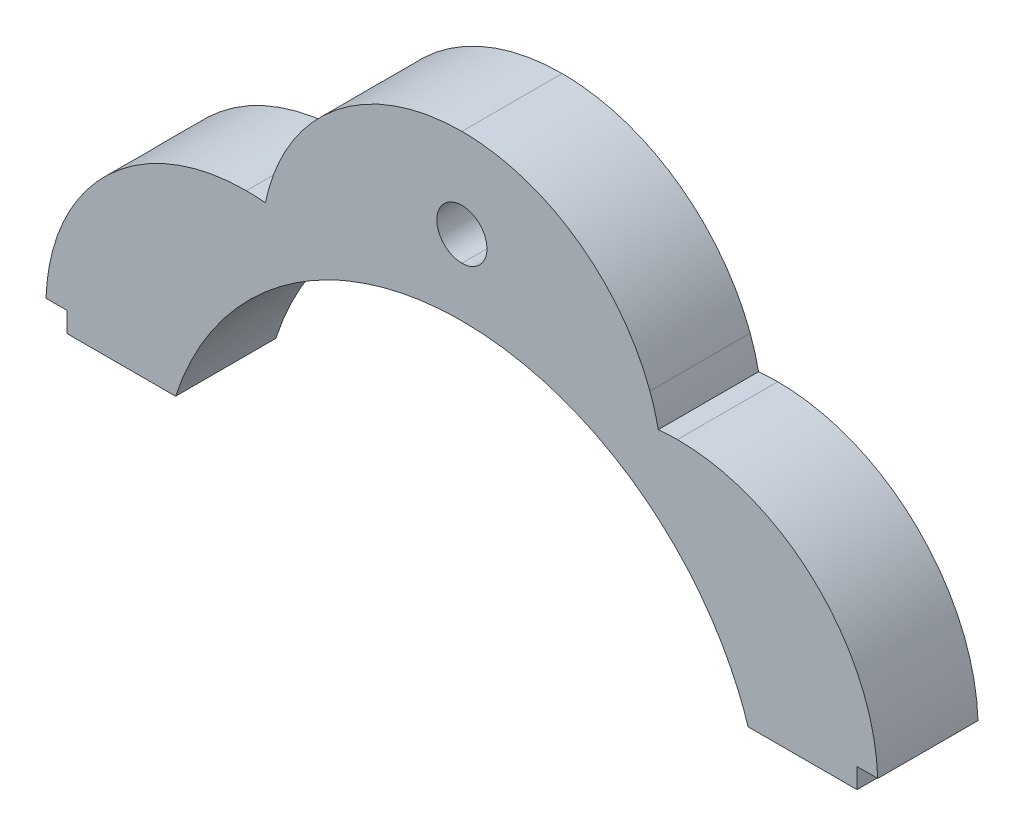
ISO-10303-21;
HEADER;
FILE_DESCRIPTION(('STEP AP214'),'2;1');
FILE_NAME('part.step','',(''),(''),'','','');
FILE_SCHEMA(('AUTOMOTIVE_DESIGN { 1 0 10303 214 1 1 1 1 }'));
ENDSEC;
DATA;
#1=APPLICATION_CONTEXT('core data for automotive mechanical design processes');
#2=APPLICATION_PROTOCOL_DEFINITION('international standard','automotive_design',2000,#1);
#3=PRODUCT_CONTEXT('',#1,'mechanical');
#4=PRODUCT('Part','Part','',(#3));
#5=PRODUCT_RELATED_PRODUCT_CATEGORY('part','',(#4));
#6=PRODUCT_DEFINITION_FORMATION('','',#4);
#7=PRODUCT_DEFINITION_CONTEXT('part definition',#1,'design');
#8=PRODUCT_DEFINITION('design','',#6,#7);
#9=PRODUCT_DEFINITION_SHAPE('','',#8);
#10=(LENGTH_UNIT() NAMED_UNIT(*) SI_UNIT(.MILLI.,.METRE.));
#11=(NAMED_UNIT(*) PLANE_ANGLE_UNIT() SI_UNIT($,.RADIAN.));
#12=(NAMED_UNIT(*) SI_UNIT($,.STERADIAN.) SOLID_ANGLE_UNIT());
#13=UNCERTAINTY_MEASURE_WITH_UNIT(LENGTH_MEASURE(1.E-05),#10,'distance_accuracy_value','');
#14=(GEOMETRIC_REPRESENTATION_CONTEXT(3) GLOBAL_UNCERTAINTY_ASSIGNED_CONTEXT((#13)) GLOBAL_UNIT_ASSIGNED_CONTEXT((#10,
#11,#12)) REPRESENTATION_CONTEXT('',''));
#15=CARTESIAN_POINT('',(0.,0.,0.));
#16=DIRECTION('',(0.,0.,1.));
#17=DIRECTION('',(1.,0.,0.));
#18=AXIS2_PLACEMENT_3D('',#15,#16,#17);
#19=CARTESIAN_POINT('',(-16.7632277139403,-1.22893531632878,10.));
#20=DIRECTION('',(0.,0.,-1.));
#21=DIRECTION('',(-1.,0.,0.));
#22=AXIS2_PLACEMENT_3D('',#19,#20,#21);
#23=PLANE('',#22);
#24=CARTESIAN_POINT('',(-10.6826691717253,-14.891134333299,10.));
#25=CARTESIAN_POINT('',(-11.0566127548024,-4.17374372454169,10.));
#26=CARTESIAN_POINT('',(-19.8619323055525,4.39522074407345,10.));
#27=CARTESIAN_POINT('',(-30.6675173587321,4.39522074407345,10.));
#28=B_SPLINE_CURVE_WITH_KNOTS('',3,(#24,#25,#26,#27),.UNSPECIFIED.,.F.,.F.,(4,4),(19.,20.),.UNSPECIFIED.);
#29=CARTESIAN_POINT('',(-10.6826691717253,-14.891134333299,10.));
#30=VERTEX_POINT('',#29);
#31=CARTESIAN_POINT('',(-30.6675173587321,4.39522074407345,10.));
#32=VERTEX_POINT('',#31);
#33=EDGE_CURVE('E373',#30,#32,#28,.T.);
#34=ORIENTED_EDGE('',*,*,#33,.T.);
#35=CARTESIAN_POINT('',(-30.6675173587321,4.39522074407345,10.));
#36=CARTESIAN_POINT('',(-31.3095754979488,4.39522074407345,10.));
#37=CARTESIAN_POINT('',(-31.9481024142931,4.36348280191558,10.));
#38=CARTESIAN_POINT('',(-32.576057193867,4.30349507677866,10.));
#39=B_SPLINE_CURVE_WITH_KNOTS('',3,(#35,#36,#37,#38),.UNSPECIFIED.,.F.,.F.,(4,4),(0.,1.),.UNSPECIFIED.);
#40=CARTESIAN_POINT('',(-32.576057193867,4.30349507677866,10.));
#41=VERTEX_POINT('',#40);
#42=EDGE_CURVE('E484',#32,#41,#39,.T.);
#43=ORIENTED_EDGE('',*,*,#42,.T.);
#44=CARTESIAN_POINT('',(-32.576057193867,4.30349507677866,10.));
#45=CARTESIAN_POINT('',(-32.7806528019973,5.30186221655729,10.));
#46=CARTESIAN_POINT('',(-33.0628922496264,6.27553232807602,10.));
#47=CARTESIAN_POINT('',(-33.4086075815712,7.21744296559011,10.));
#48=B_SPLINE_CURVE_WITH_KNOTS('',3,(#44,#45,#46,#47),.UNSPECIFIED.,.F.,.F.,(4,4),(1.,2.),.UNSPECIFIED.);
#49=CARTESIAN_POINT('',(-33.4086075815712,7.21744296559011,10.));
#50=VERTEX_POINT('',#49);
#51=EDGE_CURVE('E433',#41,#50,#48,.T.);
#52=ORIENTED_EDGE('',*,*,#51,.T.);
#53=CARTESIAN_POINT('',(-33.4086075815712,7.21744296559011,10.));
#54=CARTESIAN_POINT('',(-36.2308298030879,14.8374558827932,10.));
#55=CARTESIAN_POINT('',(-43.5650720497894,20.2702207401047,10.));
#56=CARTESIAN_POINT('',(-52.1693272152816,20.2702207401047,10.));
#57=B_SPLINE_CURVE_WITH_KNOTS('',3,(#53,#54,#55,#56),.UNSPECIFIED.,.F.,.F.,(4,4),(2.,3.),.UNSPECIFIED.);
#58=CARTESIAN_POINT('',(-52.1693272152816,20.2702207401047,10.));
#59=VERTEX_POINT('',#58);
#60=EDGE_CURVE('E451',#50,#59,#57,.T.);
#61=ORIENTED_EDGE('',*,*,#60,.T.);
#62=CARTESIAN_POINT('',(-52.1693272152816,20.2702207401047,10.));
#63=CARTESIAN_POINT('',(-60.7735823807738,20.2702207401047,10.));
#64=CARTESIAN_POINT('',(-68.1078246274754,14.8374558827932,10.));
#65=CARTESIAN_POINT('',(-70.930046848992,7.21744296559011,10.));
#66=B_SPLINE_CURVE_WITH_KNOTS('',3,(#62,#63,#64,#65),.UNSPECIFIED.,.F.,.F.,(4,4),(3.,4.),.UNSPECIFIED.);
#67=CARTESIAN_POINT('',(-70.930046848992,7.21744296559011,10.));
#68=VERTEX_POINT('',#67);
#69=EDGE_CURVE('E448',#59,#68,#66,.T.);
#70=ORIENTED_EDGE('',*,*,#69,.T.);
#71=CARTESIAN_POINT('',(-70.930046848992,7.21744296559011,10.));
#72=CARTESIAN_POINT('',(-71.2757837127836,6.27553232807602,10.));
#73=CARTESIAN_POINT('',(-71.558001628566,5.30186221655729,10.));
#74=CARTESIAN_POINT('',(-71.7625972366962,4.30349507677866,10.));
#75=B_SPLINE_CURVE_WITH_KNOTS('',3,(#71,#72,#73,#74),.UNSPECIFIED.,.F.,.F.,(4,4),(4.,5.),.UNSPECIFIED.);
#76=CARTESIAN_POINT('',(-71.7625972366962,4.30349507677866,10.));
#77=VERTEX_POINT('',#76);
#78=EDGE_CURVE('E450',#68,#77,#75,.T.);
#79=ORIENTED_EDGE('',*,*,#78,.T.);
#80=CARTESIAN_POINT('',(-71.7625972366962,4.30349507677866,10.));
#81=CARTESIAN_POINT('',(-72.3905520162701,4.36348280191558,10.));
#82=CARTESIAN_POINT('',(-73.025547709742,4.39522074407345,10.));
#83=CARTESIAN_POINT('',(-73.6676058489587,4.39522074407345,10.));
#84=B_SPLINE_CURVE_WITH_KNOTS('',3,(#80,#81,#82,#83),.UNSPECIFIED.,.F.,.F.,(4,4),(5.,6.),.UNSPECIFIED.);
#85=CARTESIAN_POINT('',(-73.6676058489587,4.39522074407345,10.));
#86=VERTEX_POINT('',#85);
#87=EDGE_CURVE('E453',#77,#86,#84,.T.);
#88=ORIENTED_EDGE('',*,*,#87,.T.);
#89=CARTESIAN_POINT('',(-73.6676058489587,4.39522074407345,10.));
#90=CARTESIAN_POINT('',(-84.4767221250108,4.39522074407345,10.));
#91=CARTESIAN_POINT('',(-93.2820416757608,-4.17374372454169,10.));
#92=CARTESIAN_POINT('',(-93.6559852588379,-14.891134333299,10.));
#93=B_SPLINE_CURVE_WITH_KNOTS('',3,(#89,#90,#91,#92),.UNSPECIFIED.,.F.,.F.,(4,4),(6.,7.),.UNSPECIFIED.);
#94=CARTESIAN_POINT('',(-93.6559852588379,-14.891134333299,10.));
#95=VERTEX_POINT('',#94);
#96=EDGE_CURVE('E801',#86,#95,#93,.T.);
#97=ORIENTED_EDGE('',*,*,#96,.T.);
#98=DIRECTION('',(1.,0.,0.));
#99=VECTOR('',#98,1.);
#100=CARTESIAN_POINT('',(-93.6559852588379,-14.891134333299,10.));
#101=LINE('',#100,#99);
#102=CARTESIAN_POINT('',(-91.5851814263478,-14.891134333299,10.));
#103=VERTEX_POINT('',#102);
#104=EDGE_CURVE('E799',#95,#103,#101,.T.);
#105=ORIENTED_EDGE('',*,*,#104,.T.);
#106=DIRECTION('',(0.,-1.,0.));
#107=VECTOR('',#106,1.);
#108=CARTESIAN_POINT('',(-91.5851814263478,-14.891134333299,10.));
#109=LINE('',#108,#107);
#110=CARTESIAN_POINT('',(-91.5851814263478,-16.8913783038818,10.));
#111=VERTEX_POINT('',#110);
#112=EDGE_CURVE('E797',#103,#111,#109,.T.);
#113=ORIENTED_EDGE('',*,*,#112,.T.);
#114=DIRECTION('',(1.,0.,0.));
#115=VECTOR('',#114,1.);
#116=CARTESIAN_POINT('',(-91.5851814263478,-16.8913783038818,10.));
#117=LINE('',#116,#115);
#118=CARTESIAN_POINT('',(-80.7266926256227,-16.8913783038818,10.));
#119=VERTEX_POINT('',#118);
#120=EDGE_CURVE('E792',#111,#119,#117,.T.);
#121=ORIENTED_EDGE('',*,*,#120,.T.);
#122=CARTESIAN_POINT('',(-80.7266926256227,-16.8913783038818,10.));
#123=CARTESIAN_POINT('',(-79.0298323762097,-11.6208774439256,10.));
#124=CARTESIAN_POINT('',(-75.9112673474212,-6.985393809288,10.));
#125=CARTESIAN_POINT('',(-71.8225849618331,-3.43645022700467,10.));
#126=B_SPLINE_CURVE_WITH_KNOTS('',3,(#122,#123,#124,#125),.UNSPECIFIED.,.F.,.F.,(4,4),(10.,11.),.UNSPECIFIED.);
#127=CARTESIAN_POINT('',(-71.8225849618331,-3.43645022700467,10.));
#128=VERTEX_POINT('',#127);
#129=EDGE_CURVE('E784',#119,#128,#126,.T.);
#130=ORIENTED_EDGE('',*,*,#129,.T.);
#131=CARTESIAN_POINT('',(-71.8225849618331,-3.43645022700467,10.));
#132=CARTESIAN_POINT('',(-69.3813472372915,-1.31978356086716,10.));
#133=CARTESIAN_POINT('',(-66.5979469355243,0.412367385422892,10.));
#134=CARTESIAN_POINT('',(-63.5605139054134,1.65766174410679,10.));
#135=B_SPLINE_CURVE_WITH_KNOTS('',3,(#131,#132,#133,#134),.UNSPECIFIED.,.F.,.F.,(4,4),(11.,12.),.UNSPECIFIED.);
#136=CARTESIAN_POINT('',(-63.5605139054134,1.65766174410679,10.));
#137=VERTEX_POINT('',#136);
#138=EDGE_CURVE('E768',#128,#137,#135,.T.);
#139=ORIENTED_EDGE('',*,*,#138,.T.);
#140=CARTESIAN_POINT('',(-63.5605139054134,1.65766174410679,10.));
#141=CARTESIAN_POINT('',(-60.0468610200071,3.10053232886977,10.));
#142=CARTESIAN_POINT('',(-56.2015746304519,3.89781355154371,10.));
#143=CARTESIAN_POINT('',(-52.1693272152816,3.89781355154371,10.));
#144=B_SPLINE_CURVE_WITH_KNOTS('',3,(#140,#141,#142,#143),.UNSPECIFIED.,.F.,.F.,(4,4),(12.,13.),.UNSPECIFIED.);
#145=CARTESIAN_POINT('',(-52.1693272152816,3.89781355154371,10.));
#146=VERTEX_POINT('',#145);
#147=EDGE_CURVE('E767',#137,#146,#144,.T.);
#148=ORIENTED_EDGE('',*,*,#147,.T.);
#149=CARTESIAN_POINT('',(-52.1693272152816,3.89781355154371,10.));
#150=CARTESIAN_POINT('',(-48.1370798001113,3.89781355154371,10.));
#151=CARTESIAN_POINT('',(-44.2882837195305,3.10053232886977,10.));
#152=CARTESIAN_POINT('',(-40.7746093022774,1.65415205308119,10.));
#153=B_SPLINE_CURVE_WITH_KNOTS('',3,(#149,#150,#151,#152),.UNSPECIFIED.,.F.,.F.,(4,4),(13.,14.),.UNSPECIFIED.);
#154=CARTESIAN_POINT('',(-40.7746093022774,1.65415205308119,10.));
#155=VERTEX_POINT('',#154);
#156=EDGE_CURVE('E766',#146,#155,#153,.T.);
#157=ORIENTED_EDGE('',*,*,#156,.T.);
#158=CARTESIAN_POINT('',(-40.7746093022774,1.65415205308119,10.));
#159=CARTESIAN_POINT('',(-37.7407074950389,0.40883616255051,10.));
#160=CARTESIAN_POINT('',(-34.9537759703993,-1.31978356086716,10.));
#161=CARTESIAN_POINT('',(-32.5160694687301,-3.43645022700467,10.));
#162=B_SPLINE_CURVE_WITH_KNOTS('',3,(#158,#159,#160,#161),.UNSPECIFIED.,.F.,.F.,(4,4),(14.,15.),.UNSPECIFIED.);
#163=CARTESIAN_POINT('',(-32.5160694687301,-3.43645022700467,10.));
#164=VERTEX_POINT('',#163);
#165=EDGE_CURVE('E248',#155,#164,#162,.T.);
#166=ORIENTED_EDGE('',*,*,#165,.T.);
#167=CARTESIAN_POINT('',(-32.5160694687301,-3.43645022700467,10.));
#168=CARTESIAN_POINT('',(-28.427387083142,-6.985393809288,10.));
#169=CARTESIAN_POINT('',(-25.3088220543535,-11.6208774439256,10.));
#170=CARTESIAN_POINT('',(-23.6119618049405,-16.8913783038818,10.));
#171=B_SPLINE_CURVE_WITH_KNOTS('',3,(#167,#168,#169,#170),.UNSPECIFIED.,.F.,.F.,(4,4),(15.,16.),.UNSPECIFIED.);
#172=CARTESIAN_POINT('',(-23.6119618049405,-16.8913783038818,10.));
#173=VERTEX_POINT('',#172);
#174=EDGE_CURVE('E242',#164,#173,#171,.T.);
#175=ORIENTED_EDGE('',*,*,#174,.T.);
#176=DIRECTION('',(1.,0.,0.));
#177=VECTOR('',#176,1.);
#178=CARTESIAN_POINT('',(-23.6119618049405,-16.8913783038818,10.));
#179=LINE('',#178,#177);
#180=CARTESIAN_POINT('',(-12.7534730042154,-16.8913783038818,10.));
#181=VERTEX_POINT('',#180);
#182=EDGE_CURVE('E247',#173,#181,#179,.T.);
#183=ORIENTED_EDGE('',*,*,#182,.T.);
#184=DIRECTION('',(0.,1.,0.));
#185=VECTOR('',#184,1.);
#186=CARTESIAN_POINT('',(-12.7534730042154,-16.8913783038818,10.));
#187=LINE('',#186,#185);
#188=CARTESIAN_POINT('',(-12.7534730042154,-14.891134333299,10.));
#189=VERTEX_POINT('',#188);
#190=EDGE_CURVE('E257',#181,#189,#187,.T.);
#191=ORIENTED_EDGE('',*,*,#190,.T.);
#192=DIRECTION('',(1.,0.,0.));
#193=VECTOR('',#192,1.);
#194=CARTESIAN_POINT('',(-12.7534730042154,-14.891134333299,10.));
#195=LINE('',#194,#193);
#196=EDGE_CURVE('E259',#189,#30,#195,.T.);
#197=ORIENTED_EDGE('',*,*,#196,.T.);
#198=EDGE_LOOP('',(#34,#43,#52,#61,#70,#79,#88,#97,#105,#113,#121,#130,#139,#148,#157,#166,#175,
#183,#191,#197));
#199=FACE_BOUND('',#198,.T.);
#200=CARTESIAN_POINT('',(-52.1693272152816,8.88256527284527,10.));
#201=CARTESIAN_POINT('',(-50.7899755785279,8.88256527284527,10.));
#202=CARTESIAN_POINT('',(-49.6681448292967,10.0043960220765,10.));
#203=CARTESIAN_POINT('',(-49.6681448292967,11.3837476588302,10.));
#204=CARTESIAN_POINT('',(-49.6681448292967,12.7631208274307,10.));
#205=CARTESIAN_POINT('',(-50.7899755785279,13.8849515766619,10.));
#206=CARTESIAN_POINT('',(-52.1693272152816,13.8849515766619,10.));
#207=B_SPLINE_CURVE_WITH_KNOTS('',3,(#200,#201,#202,#203,#204,#205,#206),.UNSPECIFIED.,.F.,.F.,
(4,3,4),(0.,1.,2.),.UNSPECIFIED.);
#208=CARTESIAN_POINT('',(-52.1693272152816,8.88256527284527,10.));
#209=VERTEX_POINT('',#208);
#210=CARTESIAN_POINT('',(-52.1693272152816,13.8849515766619,10.));
#211=VERTEX_POINT('',#210);
#212=EDGE_CURVE('E194',#209,#211,#207,.T.);
#213=ORIENTED_EDGE('',*,*,#212,.F.);
#214=CARTESIAN_POINT('',(-52.1693272152816,13.8849515766619,10.));
#215=CARTESIAN_POINT('',(-53.5487003838821,13.8849515766619,10.));
#216=CARTESIAN_POINT('',(-54.6705311331133,12.7631208274307,10.));
#217=CARTESIAN_POINT('',(-54.6705311331133,11.3837476588302,10.));
#218=CARTESIAN_POINT('',(-54.6705311331133,10.0043960220765,10.));
#219=CARTESIAN_POINT('',(-53.5487003838821,8.88256527284527,10.));
#220=CARTESIAN_POINT('',(-52.1693272152816,8.88256527284527,10.));
#221=B_SPLINE_CURVE_WITH_KNOTS('',3,(#214,#215,#216,#217,#218,#219,#220),.UNSPECIFIED.,.F.,.F.,
(4,3,4),(2.,3.,4.),.UNSPECIFIED.);
#222=EDGE_CURVE('E188',#211,#209,#221,.T.);
#223=ORIENTED_EDGE('',*,*,#222,.F.);
#224=EDGE_LOOP('',(#213,#223));
#225=FACE_BOUND('',#224,.T.);
#226=ADVANCED_FACE('F39',(#199,#225),#23,.F.);
#227=CARTESIAN_POINT('',(-16.7632277139403,-1.22893531632878,0.));
#228=DIRECTION('',(0.,0.,-1.));
#229=DIRECTION('',(-1.,0.,0.));
#230=AXIS2_PLACEMENT_3D('',#227,#228,#229);
#231=PLANE('',#230);
#232=CARTESIAN_POINT('',(-10.6826691717253,-14.891134333299,0.));
#233=CARTESIAN_POINT('',(-11.0566127548024,-4.17374372454169,0.));
#234=CARTESIAN_POINT('',(-19.8619323055525,4.39522074407345,0.));
#235=CARTESIAN_POINT('',(-30.6675173587321,4.39522074407345,0.));
#236=B_SPLINE_CURVE_WITH_KNOTS('',3,(#232,#233,#234,#235),.UNSPECIFIED.,.F.,.F.,(4,4),(19.,20.),.UNSPECIFIED.);
#237=CARTESIAN_POINT('',(-10.6826691717253,-14.891134333299,0.));
#238=VERTEX_POINT('',#237);
#239=CARTESIAN_POINT('',(-30.6675173587321,4.39522074407345,0.));
#240=VERTEX_POINT('',#239);
#241=EDGE_CURVE('E262',#238,#240,#236,.T.);
#242=ORIENTED_EDGE('',*,*,#241,.F.);
#243=DIRECTION('',(1.,0.,0.));
#244=VECTOR('',#243,1.);
#245=CARTESIAN_POINT('',(-12.7534730042154,-14.891134333299,0.));
#246=LINE('',#245,#244);
#247=CARTESIAN_POINT('',(-12.7534730042154,-14.891134333299,0.));
#248=VERTEX_POINT('',#247);
#249=EDGE_CURVE('E371',#248,#238,#246,.T.);
#250=ORIENTED_EDGE('',*,*,#249,.F.);
#251=DIRECTION('',(0.,1.,0.));
#252=VECTOR('',#251,1.);
#253=CARTESIAN_POINT('',(-12.7534730042154,-16.8913783038818,0.));
#254=LINE('',#253,#252);
#255=CARTESIAN_POINT('',(-12.7534730042154,-16.8913783038818,0.));
#256=VERTEX_POINT('',#255);
#257=EDGE_CURVE('E369',#256,#248,#254,.T.);
#258=ORIENTED_EDGE('',*,*,#257,.F.);
#259=DIRECTION('',(1.,0.,0.));
#260=VECTOR('',#259,1.);
#261=CARTESIAN_POINT('',(-23.6119618049405,-16.8913783038818,0.));
#262=LINE('',#261,#260);
#263=CARTESIAN_POINT('',(-23.6119618049405,-16.8913783038818,0.));
#264=VERTEX_POINT('',#263);
#265=EDGE_CURVE('E364',#264,#256,#262,.T.);
#266=ORIENTED_EDGE('',*,*,#265,.F.);
#267=CARTESIAN_POINT('',(-32.5160694687301,-3.43645022700467,0.));
#268=CARTESIAN_POINT('',(-28.427387083142,-6.985393809288,0.));
#269=CARTESIAN_POINT('',(-25.3088220543535,-11.6208774439256,0.));
#270=CARTESIAN_POINT('',(-23.6119618049405,-16.8913783038818,0.));
#271=B_SPLINE_CURVE_WITH_KNOTS('',3,(#267,#268,#269,#270),.UNSPECIFIED.,.F.,.F.,(4,4),(15.,16.),.UNSPECIFIED.);
#272=CARTESIAN_POINT('',(-32.5160694687301,-3.43645022700467,0.));
#273=VERTEX_POINT('',#272);
#274=EDGE_CURVE('E357',#273,#264,#271,.T.);
#275=ORIENTED_EDGE('',*,*,#274,.F.);
#276=CARTESIAN_POINT('',(-40.7746093022774,1.65415205308119,0.));
#277=CARTESIAN_POINT('',(-37.7407074950389,0.40883616255051,0.));
#278=CARTESIAN_POINT('',(-34.9537759703993,-1.31978356086716,0.));
#279=CARTESIAN_POINT('',(-32.5160694687301,-3.43645022700467,0.));
#280=B_SPLINE_CURVE_WITH_KNOTS('',3,(#276,#277,#278,#279),.UNSPECIFIED.,.F.,.F.,(4,4),(14.,15.),.UNSPECIFIED.);
#281=CARTESIAN_POINT('',(-40.7746093022774,1.65415205308119,0.));
#282=VERTEX_POINT('',#281);
#283=EDGE_CURVE('E350',#282,#273,#280,.T.);
#284=ORIENTED_EDGE('',*,*,#283,.F.);
#285=CARTESIAN_POINT('',(-52.1693272152816,3.89781355154371,0.));
#286=CARTESIAN_POINT('',(-48.1370798001113,3.89781355154371,0.));
#287=CARTESIAN_POINT('',(-44.2882837195305,3.10053232886977,0.));
#288=CARTESIAN_POINT('',(-40.7746093022774,1.65415205308119,0.));
#289=B_SPLINE_CURVE_WITH_KNOTS('',3,(#285,#286,#287,#288),.UNSPECIFIED.,.F.,.F.,(4,4),(13.,14.),.UNSPECIFIED.);
#290=CARTESIAN_POINT('',(-52.1693272152816,3.89781355154371,0.));
#291=VERTEX_POINT('',#290);
#292=EDGE_CURVE('E343',#291,#282,#289,.T.);
#293=ORIENTED_EDGE('',*,*,#292,.F.);
#294=CARTESIAN_POINT('',(-63.5605139054134,1.65766174410679,0.));
#295=CARTESIAN_POINT('',(-60.0468610200071,3.10053232886977,0.));
#296=CARTESIAN_POINT('',(-56.2015746304519,3.89781355154371,0.));
#297=CARTESIAN_POINT('',(-52.1693272152816,3.89781355154371,0.));
#298=B_SPLINE_CURVE_WITH_KNOTS('',3,(#294,#295,#296,#297),.UNSPECIFIED.,.F.,.F.,(4,4),(12.,13.),.UNSPECIFIED.);
#299=CARTESIAN_POINT('',(-63.5605139054134,1.65766174410679,0.));
#300=VERTEX_POINT('',#299);
#301=EDGE_CURVE('E336',#300,#291,#298,.T.);
#302=ORIENTED_EDGE('',*,*,#301,.F.);
#303=CARTESIAN_POINT('',(-71.8225849618331,-3.43645022700467,0.));
#304=CARTESIAN_POINT('',(-69.3813472372915,-1.31978356086716,0.));
#305=CARTESIAN_POINT('',(-66.5979469355243,0.412367385422892,0.));
#306=CARTESIAN_POINT('',(-63.5605139054134,1.65766174410679,0.));
#307=B_SPLINE_CURVE_WITH_KNOTS('',3,(#303,#304,#305,#306),.UNSPECIFIED.,.F.,.F.,(4,4),(11.,12.),.UNSPECIFIED.);
#308=CARTESIAN_POINT('',(-71.8225849618331,-3.43645022700467,0.));
#309=VERTEX_POINT('',#308);
#310=EDGE_CURVE('E329',#309,#300,#307,.T.);
#311=ORIENTED_EDGE('',*,*,#310,.F.);
#312=CARTESIAN_POINT('',(-80.7266926256227,-16.8913783038818,0.));
#313=CARTESIAN_POINT('',(-79.0298323762097,-11.6208774439256,0.));
#314=CARTESIAN_POINT('',(-75.9112673474212,-6.985393809288,0.));
#315=CARTESIAN_POINT('',(-71.8225849618331,-3.43645022700467,0.));
#316=B_SPLINE_CURVE_WITH_KNOTS('',3,(#312,#313,#314,#315),.UNSPECIFIED.,.F.,.F.,(4,4),(10.,11.),.UNSPECIFIED.);
#317=CARTESIAN_POINT('',(-80.7266926256227,-16.8913783038818,0.));
#318=VERTEX_POINT('',#317);
#319=EDGE_CURVE('E325',#318,#309,#316,.T.);
#320=ORIENTED_EDGE('',*,*,#319,.F.);
#321=DIRECTION('',(1.,0.,0.));
#322=VECTOR('',#321,1.);
#323=CARTESIAN_POINT('',(-91.5851814263478,-16.8913783038818,0.));
#324=LINE('',#323,#322);
#325=CARTESIAN_POINT('',(-91.5851814263478,-16.8913783038818,0.));
#326=VERTEX_POINT('',#325);
#327=EDGE_CURVE('E323',#326,#318,#324,.T.);
#328=ORIENTED_EDGE('',*,*,#327,.F.);
#329=DIRECTION('',(0.,-1.,0.));
#330=VECTOR('',#329,1.);
#331=CARTESIAN_POINT('',(-91.5851814263478,-14.891134333299,0.));
#332=LINE('',#331,#330);
#333=CARTESIAN_POINT('',(-91.5851814263478,-14.891134333299,0.));
#334=VERTEX_POINT('',#333);
#335=EDGE_CURVE('E321',#334,#326,#332,.T.);
#336=ORIENTED_EDGE('',*,*,#335,.F.);
#337=DIRECTION('',(1.,0.,0.));
#338=VECTOR('',#337,1.);
#339=CARTESIAN_POINT('',(-93.6559852588379,-14.891134333299,0.));
#340=LINE('',#339,#338);
#341=CARTESIAN_POINT('',(-93.6559852588379,-14.891134333299,0.));
#342=VERTEX_POINT('',#341);
#343=EDGE_CURVE('E316',#342,#334,#340,.T.);
#344=ORIENTED_EDGE('',*,*,#343,.F.);
#345=CARTESIAN_POINT('',(-73.6676058489587,4.39522074407345,0.));
#346=CARTESIAN_POINT('',(-84.4767221250108,4.39522074407345,0.));
#347=CARTESIAN_POINT('',(-93.2820416757608,-4.17374372454169,0.));
#348=CARTESIAN_POINT('',(-93.6559852588379,-14.891134333299,0.));
#349=B_SPLINE_CURVE_WITH_KNOTS('',3,(#345,#346,#347,#348),.UNSPECIFIED.,.F.,.F.,(4,4),(6.,7.),.UNSPECIFIED.);
#350=CARTESIAN_POINT('',(-73.6676058489587,4.39522074407345,0.));
#351=VERTEX_POINT('',#350);
#352=EDGE_CURVE('E309',#351,#342,#349,.T.);
#353=ORIENTED_EDGE('',*,*,#352,.F.);
#354=CARTESIAN_POINT('',(-71.7625972366962,4.30349507677866,0.));
#355=CARTESIAN_POINT('',(-72.3905520162701,4.36348280191558,0.));
#356=CARTESIAN_POINT('',(-73.025547709742,4.39522074407345,0.));
#357=CARTESIAN_POINT('',(-73.6676058489587,4.39522074407345,0.));
#358=B_SPLINE_CURVE_WITH_KNOTS('',3,(#354,#355,#356,#357),.UNSPECIFIED.,.F.,.F.,(4,4),(5.,6.),.UNSPECIFIED.);
#359=CARTESIAN_POINT('',(-71.7625972366962,4.30349507677866,0.));
#360=VERTEX_POINT('',#359);
#361=EDGE_CURVE('E302',#360,#351,#358,.T.);
#362=ORIENTED_EDGE('',*,*,#361,.F.);
#363=CARTESIAN_POINT('',(-70.930046848992,7.21744296559011,0.));
#364=CARTESIAN_POINT('',(-71.2757837127836,6.27553232807602,0.));
#365=CARTESIAN_POINT('',(-71.558001628566,5.30186221655729,0.));
#366=CARTESIAN_POINT('',(-71.7625972366962,4.30349507677866,0.));
#367=B_SPLINE_CURVE_WITH_KNOTS('',3,(#363,#364,#365,#366),.UNSPECIFIED.,.F.,.F.,(4,4),(4.,5.),.UNSPECIFIED.);
#368=CARTESIAN_POINT('',(-70.930046848992,7.21744296559011,0.));
#369=VERTEX_POINT('',#368);
#370=EDGE_CURVE('E295',#369,#360,#367,.T.);
#371=ORIENTED_EDGE('',*,*,#370,.F.);
#372=CARTESIAN_POINT('',(-52.1693272152816,20.2702207401047,0.));
#373=CARTESIAN_POINT('',(-60.7735823807738,20.2702207401047,0.));
#374=CARTESIAN_POINT('',(-68.1078246274754,14.8374558827932,0.));
#375=CARTESIAN_POINT('',(-70.930046848992,7.21744296559011,0.));
#376=B_SPLINE_CURVE_WITH_KNOTS('',3,(#372,#373,#374,#375),.UNSPECIFIED.,.F.,.F.,(4,4),(3.,4.),.UNSPECIFIED.);
#377=CARTESIAN_POINT('',(-52.1693272152816,20.2702207401047,0.));
#378=VERTEX_POINT('',#377);
#379=EDGE_CURVE('E288',#378,#369,#376,.T.);
#380=ORIENTED_EDGE('',*,*,#379,.F.);
#381=CARTESIAN_POINT('',(-33.4086075815712,7.21744296559011,0.));
#382=CARTESIAN_POINT('',(-36.2308298030879,14.8374558827932,0.));
#383=CARTESIAN_POINT('',(-43.5650720497894,20.2702207401047,0.));
#384=CARTESIAN_POINT('',(-52.1693272152816,20.2702207401047,0.));
#385=B_SPLINE_CURVE_WITH_KNOTS('',3,(#381,#382,#383,#384),.UNSPECIFIED.,.F.,.F.,(4,4),(2.,3.),.UNSPECIFIED.);
#386=CARTESIAN_POINT('',(-33.4086075815712,7.21744296559011,0.));
#387=VERTEX_POINT('',#386);
#388=EDGE_CURVE('E281',#387,#378,#385,.T.);
#389=ORIENTED_EDGE('',*,*,#388,.F.);
#390=CARTESIAN_POINT('',(-32.576057193867,4.30349507677866,0.));
#391=CARTESIAN_POINT('',(-32.7806528019973,5.30186221655729,0.));
#392=CARTESIAN_POINT('',(-33.0628922496264,6.27553232807602,0.));
#393=CARTESIAN_POINT('',(-33.4086075815712,7.21744296559011,0.));
#394=B_SPLINE_CURVE_WITH_KNOTS('',3,(#390,#391,#392,#393),.UNSPECIFIED.,.F.,.F.,(4,4),(1.,2.),.UNSPECIFIED.);
#395=CARTESIAN_POINT('',(-32.576057193867,4.30349507677866,0.));
#396=VERTEX_POINT('',#395);
#397=EDGE_CURVE('E274',#396,#387,#394,.T.);
#398=ORIENTED_EDGE('',*,*,#397,.F.);
#399=CARTESIAN_POINT('',(-30.6675173587321,4.39522074407345,0.));
#400=CARTESIAN_POINT('',(-31.3095754979488,4.39522074407345,0.));
#401=CARTESIAN_POINT('',(-31.9481024142931,4.36348280191558,0.));
#402=CARTESIAN_POINT('',(-32.576057193867,4.30349507677866,0.));
#403=B_SPLINE_CURVE_WITH_KNOTS('',3,(#399,#400,#401,#402),.UNSPECIFIED.,.F.,.F.,(4,4),(0.,1.),.UNSPECIFIED.);
#404=EDGE_CURVE('E267',#240,#396,#403,.T.);
#405=ORIENTED_EDGE('',*,*,#404,.F.);
#406=EDGE_LOOP('',(#242,#250,#258,#266,#275,#284,#293,#302,#311,#320,#328,#336,#344,#353,#362,
#371,#380,#389,#398,#405));
#407=FACE_BOUND('',#406,.T.);
#408=CARTESIAN_POINT('',(-52.1693272152816,13.8849515766619,0.));
#409=CARTESIAN_POINT('',(-53.5487003838821,13.8849515766619,0.));
#410=CARTESIAN_POINT('',(-54.6705311331133,12.7631208274307,0.));
#411=CARTESIAN_POINT('',(-54.6705311331133,11.3837476588302,0.));
#412=CARTESIAN_POINT('',(-54.6705311331133,10.0043960220765,0.));
#413=CARTESIAN_POINT('',(-53.5487003838821,8.88256527284527,0.));
#414=CARTESIAN_POINT('',(-52.1693272152816,8.88256527284527,0.));
#415=B_SPLINE_CURVE_WITH_KNOTS('',3,(#408,#409,#410,#411,#412,#413,#414),.UNSPECIFIED.,.F.,.F.,
(4,3,4),(2.,3.,4.),.UNSPECIFIED.);
#416=CARTESIAN_POINT('',(-52.1693272152816,13.8849515766619,0.));
#417=VERTEX_POINT('',#416);
#418=CARTESIAN_POINT('',(-52.1693272152816,8.88256527284527,0.));
#419=VERTEX_POINT('',#418);
#420=EDGE_CURVE('E198',#417,#419,#415,.T.);
#421=ORIENTED_EDGE('',*,*,#420,.T.);
#422=CARTESIAN_POINT('',(-52.1693272152816,8.88256527284527,0.));
#423=CARTESIAN_POINT('',(-50.7899755785279,8.88256527284527,0.));
#424=CARTESIAN_POINT('',(-49.6681448292967,10.0043960220765,0.));
#425=CARTESIAN_POINT('',(-49.6681448292967,11.3837476588302,0.));
#426=CARTESIAN_POINT('',(-49.6681448292967,12.7631208274307,0.));
#427=CARTESIAN_POINT('',(-50.7899755785279,13.8849515766619,0.));
#428=CARTESIAN_POINT('',(-52.1693272152816,13.8849515766619,0.));
#429=B_SPLINE_CURVE_WITH_KNOTS('',3,(#422,#423,#424,#425,#426,#427,#428),.UNSPECIFIED.,.F.,.F.,
(4,3,4),(0.,1.,2.),.UNSPECIFIED.);
#430=EDGE_CURVE('E62',#419,#417,#429,.T.);
#431=ORIENTED_EDGE('',*,*,#430,.T.);
#432=EDGE_LOOP('',(#421,#431));
#433=FACE_BOUND('',#432,.T.);
#434=ADVANCED_FACE('F218',(#407,#433),#231,.T.);
#435=DIRECTION('',(0.,0.,-1.));
#436=VECTOR('',#435,1.);
#437=SURFACE_OF_LINEAR_EXTRUSION('',#28,#436);
#438=ORIENTED_EDGE('',*,*,#241,.T.);
#439=DIRECTION('',(0.,0.,-1.));
#440=VECTOR('',#439,1.);
#441=CARTESIAN_POINT('',(-30.6675173587321,4.39522074407345,10.));
#442=LINE('',#441,#440);
#443=EDGE_CURVE('E11',#32,#240,#442,.T.);
#444=ORIENTED_EDGE('',*,*,#443,.F.);
#445=ORIENTED_EDGE('',*,*,#33,.F.);
#446=DIRECTION('',(0.,0.,-1.));
#447=VECTOR('',#446,1.);
#448=CARTESIAN_POINT('',(-10.6826691717253,-14.891134333299,10.));
#449=LINE('',#448,#447);
#450=EDGE_CURVE('E261',#30,#238,#449,.T.);
#451=ORIENTED_EDGE('',*,*,#450,.T.);
#452=EDGE_LOOP('',(#438,#444,#445,#451));
#453=FACE_BOUND('',#452,.T.);
#454=ADVANCED_FACE('F41',(#453),#437,.F.);
#455=DIRECTION('',(0.,0.,-1.));
#456=VECTOR('',#455,1.);
#457=SURFACE_OF_LINEAR_EXTRUSION('',#39,#456);
#458=ORIENTED_EDGE('',*,*,#404,.T.);
#459=DIRECTION('',(0.,0.,-1.));
#460=VECTOR('',#459,1.);
#461=CARTESIAN_POINT('',(-32.576057193867,4.30349507677866,10.));
#462=LINE('',#461,#460);
#463=EDGE_CURVE('E48',#41,#396,#462,.T.);
#464=ORIENTED_EDGE('',*,*,#463,.F.);
#465=ORIENTED_EDGE('',*,*,#42,.F.);
#466=ORIENTED_EDGE('',*,*,#443,.T.);
#467=EDGE_LOOP('',(#458,#464,#465,#466));
#468=FACE_BOUND('',#467,.T.);
#469=ADVANCED_FACE('F479',(#468),#457,.F.);
#470=DIRECTION('',(0.,0.,-1.));
#471=VECTOR('',#470,1.);
#472=SURFACE_OF_LINEAR_EXTRUSION('',#48,#471);
#473=ORIENTED_EDGE('',*,*,#397,.T.);
#474=DIRECTION('',(0.,0.,-1.));
#475=VECTOR('',#474,1.);
#476=CARTESIAN_POINT('',(-33.4086075815712,7.21744296559011,10.));
#477=LINE('',#476,#475);
#478=EDGE_CURVE('E424',#50,#387,#477,.T.);
#479=ORIENTED_EDGE('',*,*,#478,.F.);
#480=ORIENTED_EDGE('',*,*,#51,.F.);
#481=ORIENTED_EDGE('',*,*,#463,.T.);
#482=EDGE_LOOP('',(#473,#479,#480,#481));
#483=FACE_BOUND('',#482,.T.);
#484=ADVANCED_FACE('F431',(#483),#472,.F.);
#485=DIRECTION('',(0.,0.,-1.));
#486=VECTOR('',#485,1.);
#487=SURFACE_OF_LINEAR_EXTRUSION('',#57,#486);
#488=ORIENTED_EDGE('',*,*,#388,.T.);
#489=DIRECTION('',(0.,0.,-1.));
#490=VECTOR('',#489,1.);
#491=CARTESIAN_POINT('',(-52.1693272152816,20.2702207401047,10.));
#492=LINE('',#491,#490);
#493=EDGE_CURVE('E421',#59,#378,#492,.T.);
#494=ORIENTED_EDGE('',*,*,#493,.F.);
#495=ORIENTED_EDGE('',*,*,#60,.F.);
#496=ORIENTED_EDGE('',*,*,#478,.T.);
#497=EDGE_LOOP('',(#488,#494,#495,#496));
#498=FACE_BOUND('',#497,.T.);
#499=ADVANCED_FACE('F442',(#498),#487,.F.);
#500=DIRECTION('',(0.,0.,-1.));
#501=VECTOR('',#500,1.);
#502=SURFACE_OF_LINEAR_EXTRUSION('',#66,#501);
#503=ORIENTED_EDGE('',*,*,#379,.T.);
#504=DIRECTION('',(0.,0.,-1.));
#505=VECTOR('',#504,1.);
#506=CARTESIAN_POINT('',(-70.930046848992,7.21744296559011,10.));
#507=LINE('',#506,#505);
#508=EDGE_CURVE('E418',#68,#369,#507,.T.);
#509=ORIENTED_EDGE('',*,*,#508,.F.);
#510=ORIENTED_EDGE('',*,*,#69,.F.);
#511=ORIENTED_EDGE('',*,*,#493,.T.);
#512=EDGE_LOOP('',(#503,#509,#510,#511));
#513=FACE_BOUND('',#512,.T.);
#514=ADVANCED_FACE('F446',(#513),#502,.F.);
#515=DIRECTION('',(0.,0.,-1.));
#516=VECTOR('',#515,1.);
#517=SURFACE_OF_LINEAR_EXTRUSION('',#75,#516);
#518=ORIENTED_EDGE('',*,*,#370,.T.);
#519=DIRECTION('',(0.,0.,-1.));
#520=VECTOR('',#519,1.);
#521=CARTESIAN_POINT('',(-71.7625972366962,4.30349507677866,10.));
#522=LINE('',#521,#520);
#523=EDGE_CURVE('E415',#77,#360,#522,.T.);
#524=ORIENTED_EDGE('',*,*,#523,.F.);
#525=ORIENTED_EDGE('',*,*,#78,.F.);
#526=ORIENTED_EDGE('',*,*,#508,.T.);
#527=EDGE_LOOP('',(#518,#524,#525,#526));
#528=FACE_BOUND('',#527,.T.);
#529=ADVANCED_FACE('F474',(#528),#517,.F.);
#530=DIRECTION('',(0.,0.,-1.));
#531=VECTOR('',#530,1.);
#532=SURFACE_OF_LINEAR_EXTRUSION('',#84,#531);
#533=ORIENTED_EDGE('',*,*,#361,.T.);
#534=DIRECTION('',(0.,0.,-1.));
#535=VECTOR('',#534,1.);
#536=CARTESIAN_POINT('',(-73.6676058489587,4.39522074407345,10.));
#537=LINE('',#536,#535);
#538=EDGE_CURVE('E412',#86,#351,#537,.T.);
#539=ORIENTED_EDGE('',*,*,#538,.F.);
#540=ORIENTED_EDGE('',*,*,#87,.F.);
#541=ORIENTED_EDGE('',*,*,#523,.T.);
#542=EDGE_LOOP('',(#533,#539,#540,#541));
#543=FACE_BOUND('',#542,.T.);
#544=ADVANCED_FACE('F579',(#543),#532,.F.);
#545=DIRECTION('',(0.,0.,-1.));
#546=VECTOR('',#545,1.);
#547=SURFACE_OF_LINEAR_EXTRUSION('',#93,#546);
#548=ORIENTED_EDGE('',*,*,#352,.T.);
#549=DIRECTION('',(0.,0.,-1.));
#550=VECTOR('',#549,1.);
#551=CARTESIAN_POINT('',(-93.6559852588379,-14.891134333299,10.));
#552=LINE('',#551,#550);
#553=EDGE_CURVE('E409',#95,#342,#552,.T.);
#554=ORIENTED_EDGE('',*,*,#553,.F.);
#555=ORIENTED_EDGE('',*,*,#96,.F.);
#556=ORIENTED_EDGE('',*,*,#538,.T.);
#557=EDGE_LOOP('',(#548,#554,#555,#556));
#558=FACE_BOUND('',#557,.T.);
#559=ADVANCED_FACE('F589',(#558),#547,.F.);
#560=CARTESIAN_POINT('',(-93.6559852588379,-14.891134333299,10.));
#561=DIRECTION('',(0.,1.,0.));
#562=DIRECTION('',(0.,0.,1.));
#563=AXIS2_PLACEMENT_3D('',#560,#561,#562);
#564=PLANE('',#563);
#565=ORIENTED_EDGE('',*,*,#343,.T.);
#566=DIRECTION('',(0.,0.,-1.));
#567=VECTOR('',#566,1.);
#568=CARTESIAN_POINT('',(-91.5851814263478,-14.891134333299,10.));
#569=LINE('',#568,#567);
#570=EDGE_CURVE('E406',#103,#334,#569,.T.);
#571=ORIENTED_EDGE('',*,*,#570,.F.);
#572=ORIENTED_EDGE('',*,*,#104,.F.);
#573=ORIENTED_EDGE('',*,*,#553,.T.);
#574=EDGE_LOOP('',(#565,#571,#572,#573));
#575=FACE_BOUND('',#574,.T.);
#576=ADVANCED_FACE('F599',(#575),#564,.F.);
#577=CARTESIAN_POINT('',(-91.5851814263478,-14.891134333299,10.));
#578=DIRECTION('',(1.,0.,0.));
#579=DIRECTION('',(0.,0.,-1.));
#580=AXIS2_PLACEMENT_3D('',#577,#578,#579);
#581=PLANE('',#580);
#582=ORIENTED_EDGE('',*,*,#335,.T.);
#583=DIRECTION('',(0.,0.,-1.));
#584=VECTOR('',#583,1.);
#585=CARTESIAN_POINT('',(-91.5851814263478,-16.8913783038818,10.));
#586=LINE('',#585,#584);
#587=EDGE_CURVE('E403',#111,#326,#586,.T.);
#588=ORIENTED_EDGE('',*,*,#587,.F.);
#589=ORIENTED_EDGE('',*,*,#112,.F.);
#590=ORIENTED_EDGE('',*,*,#570,.T.);
#591=EDGE_LOOP('',(#582,#588,#589,#590));
#592=FACE_BOUND('',#591,.T.);
#593=ADVANCED_FACE('F610',(#592),#581,.F.);
#594=CARTESIAN_POINT('',(-91.5851814263478,-16.8913783038818,10.));
#595=DIRECTION('',(0.,1.,0.));
#596=DIRECTION('',(0.,0.,1.));
#597=AXIS2_PLACEMENT_3D('',#594,#595,#596);
#598=PLANE('',#597);
#599=ORIENTED_EDGE('',*,*,#327,.T.);
#600=DIRECTION('',(0.,0.,-1.));
#601=VECTOR('',#600,1.);
#602=CARTESIAN_POINT('',(-80.7266926256227,-16.8913783038818,10.));
#603=LINE('',#602,#601);
#604=EDGE_CURVE('E400',#119,#318,#603,.T.);
#605=ORIENTED_EDGE('',*,*,#604,.F.);
#606=ORIENTED_EDGE('',*,*,#120,.F.);
#607=ORIENTED_EDGE('',*,*,#587,.T.);
#608=EDGE_LOOP('',(#599,#605,#606,#607));
#609=FACE_BOUND('',#608,.T.);
#610=ADVANCED_FACE('F621',(#609),#598,.F.);
#611=DIRECTION('',(0.,0.,-1.));
#612=VECTOR('',#611,1.);
#613=SURFACE_OF_LINEAR_EXTRUSION('',#126,#612);
#614=ORIENTED_EDGE('',*,*,#319,.T.);
#615=DIRECTION('',(0.,0.,-1.));
#616=VECTOR('',#615,1.);
#617=CARTESIAN_POINT('',(-71.8225849618331,-3.43645022700467,10.));
#618=LINE('',#617,#616);
#619=EDGE_CURVE('E397',#128,#309,#618,.T.);
#620=ORIENTED_EDGE('',*,*,#619,.F.);
#621=ORIENTED_EDGE('',*,*,#129,.F.);
#622=ORIENTED_EDGE('',*,*,#604,.T.);
#623=EDGE_LOOP('',(#614,#620,#621,#622));
#624=FACE_BOUND('',#623,.T.);
#625=ADVANCED_FACE('F632',(#624),#613,.F.);
#626=DIRECTION('',(0.,0.,-1.));
#627=VECTOR('',#626,1.);
#628=SURFACE_OF_LINEAR_EXTRUSION('',#135,#627);
#629=ORIENTED_EDGE('',*,*,#310,.T.);
#630=DIRECTION('',(0.,0.,-1.));
#631=VECTOR('',#630,1.);
#632=CARTESIAN_POINT('',(-63.5605139054134,1.65766174410679,10.));
#633=LINE('',#632,#631);
#634=EDGE_CURVE('E394',#137,#300,#633,.T.);
#635=ORIENTED_EDGE('',*,*,#634,.F.);
#636=ORIENTED_EDGE('',*,*,#138,.F.);
#637=ORIENTED_EDGE('',*,*,#619,.T.);
#638=EDGE_LOOP('',(#629,#635,#636,#637));
#639=FACE_BOUND('',#638,.T.);
#640=ADVANCED_FACE('F643',(#639),#628,.F.);
#641=DIRECTION('',(0.,0.,-1.));
#642=VECTOR('',#641,1.);
#643=SURFACE_OF_LINEAR_EXTRUSION('',#144,#642);
#644=ORIENTED_EDGE('',*,*,#301,.T.);
#645=DIRECTION('',(0.,0.,-1.));
#646=VECTOR('',#645,1.);
#647=CARTESIAN_POINT('',(-52.1693272152816,3.89781355154371,10.));
#648=LINE('',#647,#646);
#649=EDGE_CURVE('E391',#146,#291,#648,.T.);
#650=ORIENTED_EDGE('',*,*,#649,.F.);
#651=ORIENTED_EDGE('',*,*,#147,.F.);
#652=ORIENTED_EDGE('',*,*,#634,.T.);
#653=EDGE_LOOP('',(#644,#650,#651,#652));
#654=FACE_BOUND('',#653,.T.);
#655=ADVANCED_FACE('F654',(#654),#643,.F.);
#656=DIRECTION('',(0.,0.,-1.));
#657=VECTOR('',#656,1.);
#658=SURFACE_OF_LINEAR_EXTRUSION('',#153,#657);
#659=ORIENTED_EDGE('',*,*,#292,.T.);
#660=DIRECTION('',(0.,0.,-1.));
#661=VECTOR('',#660,1.);
#662=CARTESIAN_POINT('',(-40.7746093022774,1.65415205308119,10.));
#663=LINE('',#662,#661);
#664=EDGE_CURVE('E388',#155,#282,#663,.T.);
#665=ORIENTED_EDGE('',*,*,#664,.F.);
#666=ORIENTED_EDGE('',*,*,#156,.F.);
#667=ORIENTED_EDGE('',*,*,#649,.T.);
#668=EDGE_LOOP('',(#659,#665,#666,#667));
#669=FACE_BOUND('',#668,.T.);
#670=ADVANCED_FACE('F665',(#669),#658,.F.);
#671=DIRECTION('',(0.,0.,-1.));
#672=VECTOR('',#671,1.);
#673=SURFACE_OF_LINEAR_EXTRUSION('',#162,#672);
#674=ORIENTED_EDGE('',*,*,#283,.T.);
#675=DIRECTION('',(0.,0.,-1.));
#676=VECTOR('',#675,1.);
#677=CARTESIAN_POINT('',(-32.5160694687301,-3.43645022700467,10.));
#678=LINE('',#677,#676);
#679=EDGE_CURVE('E385',#164,#273,#678,.T.);
#680=ORIENTED_EDGE('',*,*,#679,.F.);
#681=ORIENTED_EDGE('',*,*,#165,.F.);
#682=ORIENTED_EDGE('',*,*,#664,.T.);
#683=EDGE_LOOP('',(#674,#680,#681,#682));
#684=FACE_BOUND('',#683,.T.);
#685=ADVANCED_FACE('F238',(#684),#673,.F.);
#686=DIRECTION('',(0.,0.,-1.));
#687=VECTOR('',#686,1.);
#688=SURFACE_OF_LINEAR_EXTRUSION('',#171,#687);
#689=ORIENTED_EDGE('',*,*,#274,.T.);
#690=DIRECTION('',(0.,0.,-1.));
#691=VECTOR('',#690,1.);
#692=CARTESIAN_POINT('',(-23.6119618049405,-16.8913783038818,10.));
#693=LINE('',#692,#691);
#694=EDGE_CURVE('E382',#173,#264,#693,.T.);
#695=ORIENTED_EDGE('',*,*,#694,.F.);
#696=ORIENTED_EDGE('',*,*,#174,.F.);
#697=ORIENTED_EDGE('',*,*,#679,.T.);
#698=EDGE_LOOP('',(#689,#695,#696,#697));
#699=FACE_BOUND('',#698,.T.);
#700=ADVANCED_FACE('F233',(#699),#688,.F.);
#701=CARTESIAN_POINT('',(-23.6119618049405,-16.8913783038818,10.));
#702=DIRECTION('',(0.,1.,0.));
#703=DIRECTION('',(0.,0.,1.));
#704=AXIS2_PLACEMENT_3D('',#701,#702,#703);
#705=PLANE('',#704);
#706=ORIENTED_EDGE('',*,*,#265,.T.);
#707=DIRECTION('',(0.,0.,-1.));
#708=VECTOR('',#707,1.);
#709=CARTESIAN_POINT('',(-12.7534730042154,-16.8913783038818,10.));
#710=LINE('',#709,#708);
#711=EDGE_CURVE('E379',#181,#256,#710,.T.);
#712=ORIENTED_EDGE('',*,*,#711,.F.);
#713=ORIENTED_EDGE('',*,*,#182,.F.);
#714=ORIENTED_EDGE('',*,*,#694,.T.);
#715=EDGE_LOOP('',(#706,#712,#713,#714));
#716=FACE_BOUND('',#715,.T.);
#717=ADVANCED_FACE('F229',(#716),#705,.F.);
#718=CARTESIAN_POINT('',(-12.7534730042154,-16.8913783038818,10.));
#719=DIRECTION('',(-1.,0.,0.));
#720=DIRECTION('',(0.,0.,1.));
#721=AXIS2_PLACEMENT_3D('',#718,#719,#720);
#722=PLANE('',#721);
#723=ORIENTED_EDGE('',*,*,#257,.T.);
#724=DIRECTION('',(0.,0.,-1.));
#725=VECTOR('',#724,1.);
#726=CARTESIAN_POINT('',(-12.7534730042154,-14.891134333299,10.));
#727=LINE('',#726,#725);
#728=EDGE_CURVE('E376',#189,#248,#727,.T.);
#729=ORIENTED_EDGE('',*,*,#728,.F.);
#730=ORIENTED_EDGE('',*,*,#190,.F.);
#731=ORIENTED_EDGE('',*,*,#711,.T.);
#732=EDGE_LOOP('',(#723,#729,#730,#731));
#733=FACE_BOUND('',#732,.T.);
#734=ADVANCED_FACE('F225',(#733),#722,.F.);
#735=CARTESIAN_POINT('',(-12.7534730042154,-14.891134333299,10.));
#736=DIRECTION('',(0.,1.,0.));
#737=DIRECTION('',(0.,0.,1.));
#738=AXIS2_PLACEMENT_3D('',#735,#736,#737);
#739=PLANE('',#738);
#740=ORIENTED_EDGE('',*,*,#249,.T.);
#741=ORIENTED_EDGE('',*,*,#450,.F.);
#742=ORIENTED_EDGE('',*,*,#196,.F.);
#743=ORIENTED_EDGE('',*,*,#728,.T.);
#744=EDGE_LOOP('',(#740,#741,#742,#743));
#745=FACE_BOUND('',#744,.T.);
#746=ADVANCED_FACE('F215',(#745),#739,.F.);
#747=DIRECTION('',(0.,0.,-1.));
#748=VECTOR('',#747,1.);
#749=SURFACE_OF_LINEAR_EXTRUSION('',#207,#748);
#750=ORIENTED_EDGE('',*,*,#430,.F.);
#751=DIRECTION('',(0.,0.,-1.));
#752=VECTOR('',#751,1.);
#753=CARTESIAN_POINT('',(-52.1693272152816,8.88256527284527,10.));
#754=LINE('',#753,#752);
#755=EDGE_CURVE('E190',#209,#419,#754,.T.);
#756=ORIENTED_EDGE('',*,*,#755,.F.);
#757=ORIENTED_EDGE('',*,*,#212,.T.);
#758=DIRECTION('',(0.,0.,-1.));
#759=VECTOR('',#758,1.);
#760=CARTESIAN_POINT('',(-52.1693272152816,13.8849515766619,10.));
#761=LINE('',#760,#759);
#762=EDGE_CURVE('E55',#211,#417,#761,.T.);
#763=ORIENTED_EDGE('',*,*,#762,.T.);
#764=EDGE_LOOP('',(#750,#756,#757,#763));
#765=FACE_BOUND('',#764,.T.);
#766=ADVANCED_FACE('F196',(#765),#749,.T.);
#767=DIRECTION('',(0.,0.,-1.));
#768=VECTOR('',#767,1.);
#769=SURFACE_OF_LINEAR_EXTRUSION('',#221,#768);
#770=ORIENTED_EDGE('',*,*,#420,.F.);
#771=ORIENTED_EDGE('',*,*,#762,.F.);
#772=ORIENTED_EDGE('',*,*,#222,.T.);
#773=ORIENTED_EDGE('',*,*,#755,.T.);
#774=EDGE_LOOP('',(#770,#771,#772,#773));
#775=FACE_BOUND('',#774,.T.);
#776=ADVANCED_FACE('F189',(#775),#769,.T.);
#777=CLOSED_SHELL('',(#226,#434,#454,#469,#484,#499,#514,#529,#544,#559,#576,#593,#610,#625,
#640,#655,#670,#685,#700,#717,#734,#746,#766,#776));
#778=MANIFOLD_SOLID_BREP('B2',#777);
#779=ADVANCED_BREP_SHAPE_REPRESENTATION('',(#18,#778),#14);
#780=SHAPE_DEFINITION_REPRESENTATION(#9,#779);
ENDSEC;
END-ISO-10303-21;
